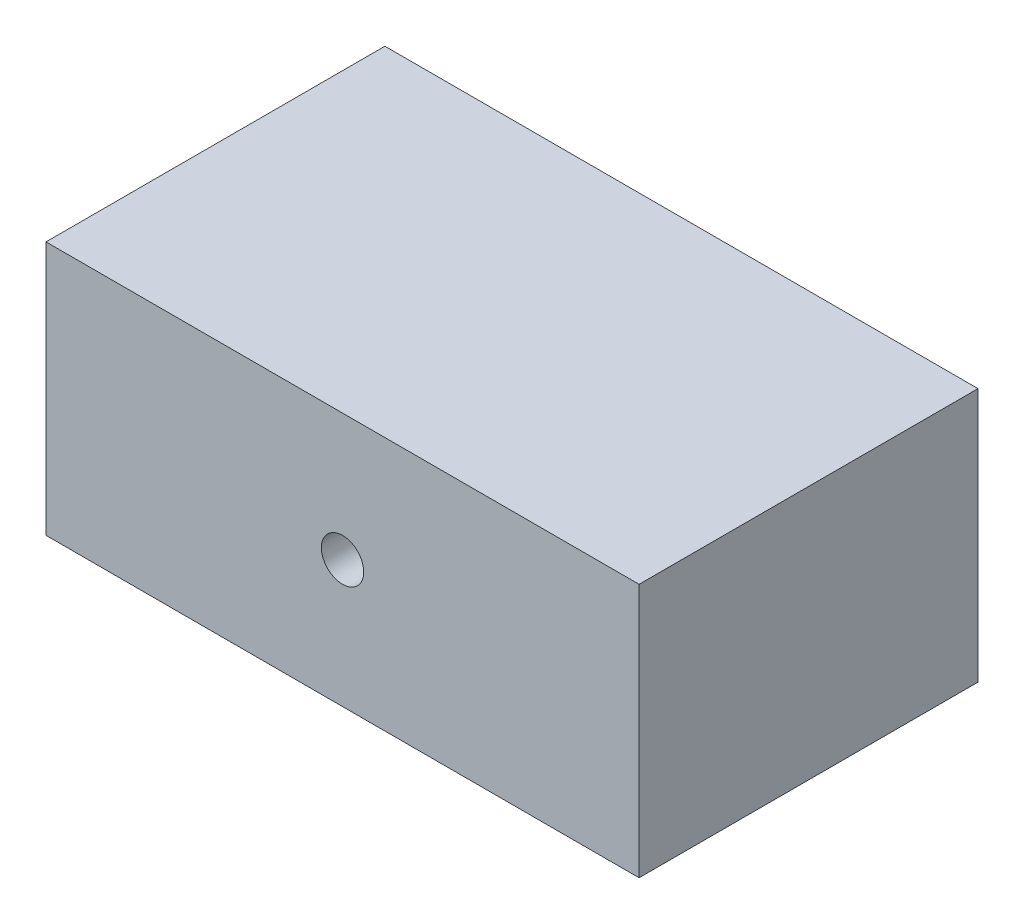
ISO-10303-21;
HEADER;
FILE_DESCRIPTION(('STEP AP214'),'2;1');
FILE_NAME('part.step','',(''),(''),'','','');
FILE_SCHEMA(('AUTOMOTIVE_DESIGN { 1 0 10303 214 1 1 1 1 }'));
ENDSEC;
DATA;
#1=APPLICATION_CONTEXT('core data for automotive mechanical design processes');
#2=APPLICATION_PROTOCOL_DEFINITION('international standard','automotive_design',2000,#1);
#3=PRODUCT_CONTEXT('',#1,'mechanical');
#4=PRODUCT('Part','Part','',(#3));
#5=PRODUCT_RELATED_PRODUCT_CATEGORY('part','',(#4));
#6=PRODUCT_DEFINITION_FORMATION('','',#4);
#7=PRODUCT_DEFINITION_CONTEXT('part definition',#1,'design');
#8=PRODUCT_DEFINITION('design','',#6,#7);
#9=PRODUCT_DEFINITION_SHAPE('','',#8);
#10=(LENGTH_UNIT() NAMED_UNIT(*) SI_UNIT(.MILLI.,.METRE.));
#11=(NAMED_UNIT(*) PLANE_ANGLE_UNIT() SI_UNIT($,.RADIAN.));
#12=(NAMED_UNIT(*) SI_UNIT($,.STERADIAN.) SOLID_ANGLE_UNIT());
#13=UNCERTAINTY_MEASURE_WITH_UNIT(LENGTH_MEASURE(1.E-05),#10,'distance_accuracy_value','');
#14=(GEOMETRIC_REPRESENTATION_CONTEXT(3) GLOBAL_UNCERTAINTY_ASSIGNED_CONTEXT((#13)) GLOBAL_UNIT_ASSIGNED_CONTEXT((#10,
#11,#12)) REPRESENTATION_CONTEXT('',''));
#15=CARTESIAN_POINT('',(0.,0.,0.));
#16=DIRECTION('',(0.,0.,1.));
#17=DIRECTION('',(1.,0.,0.));
#18=AXIS2_PLACEMENT_3D('',#15,#16,#17);
#19=CARTESIAN_POINT('',(0.,0.,50.8));
#20=DIRECTION('',(0.,0.,-1.));
#21=DIRECTION('',(-1.,0.,0.));
#22=AXIS2_PLACEMENT_3D('',#19,#20,#21);
#23=PLANE('',#22);
#24=DIRECTION('',(0.,-1.,0.));
#25=VECTOR('',#24,1.);
#26=CARTESIAN_POINT('',(0.,0.,50.8));
#27=LINE('',#26,#25);
#28=CARTESIAN_POINT('',(0.,38.1,50.8));
#29=VERTEX_POINT('',#28);
#30=CARTESIAN_POINT('',(0.,0.,50.8));
#31=VERTEX_POINT('',#30);
#32=EDGE_CURVE('E92',#29,#31,#27,.T.);
#33=ORIENTED_EDGE('',*,*,#32,.T.);
#34=DIRECTION('',(1.,0.,0.));
#35=VECTOR('',#34,1.);
#36=CARTESIAN_POINT('',(0.,0.,50.8));
#37=LINE('',#36,#35);
#38=CARTESIAN_POINT('',(88.9,0.,50.8));
#39=VERTEX_POINT('',#38);
#40=EDGE_CURVE('E87',#31,#39,#37,.T.);
#41=ORIENTED_EDGE('',*,*,#40,.T.);
#42=DIRECTION('',(0.,1.,0.));
#43=VECTOR('',#42,1.);
#44=CARTESIAN_POINT('',(88.9,0.,50.8));
#45=LINE('',#44,#43);
#46=CARTESIAN_POINT('',(88.9,38.1,50.8));
#47=VERTEX_POINT('',#46);
#48=EDGE_CURVE('E90',#39,#47,#45,.T.);
#49=ORIENTED_EDGE('',*,*,#48,.T.);
#50=DIRECTION('',(-1.,0.,0.));
#51=VECTOR('',#50,1.);
#52=CARTESIAN_POINT('',(0.,38.1,50.8));
#53=LINE('',#52,#51);
#54=EDGE_CURVE('E57',#47,#29,#53,.T.);
#55=ORIENTED_EDGE('',*,*,#54,.T.);
#56=EDGE_LOOP('',(#33,#41,#49,#55));
#57=FACE_BOUND('',#56,.T.);
#58=CARTESIAN_POINT('',(44.45,19.05,50.8));
#59=DIRECTION('',(0.,0.,1.));
#60=DIRECTION('',(1.,0.,0.));
#61=AXIS2_PLACEMENT_3D('',#58,#59,#60);
#62=CIRCLE('',#61,3.175);
#63=CARTESIAN_POINT('',(47.625,19.05,50.8));
#64=VERTEX_POINT('',#63);
#65=EDGE_CURVE('E112',#64,#64,#62,.T.);
#66=ORIENTED_EDGE('',*,*,#65,.F.);
#67=EDGE_LOOP('',(#66));
#68=FACE_BOUND('',#67,.T.);
#69=ADVANCED_FACE('F39',(#57,#68),#23,.F.);
#70=CARTESIAN_POINT('',(0.,0.,0.));
#71=DIRECTION('',(0.,0.,-1.));
#72=DIRECTION('',(-1.,0.,0.));
#73=AXIS2_PLACEMENT_3D('',#70,#71,#72);
#74=PLANE('',#73);
#75=DIRECTION('',(0.,-1.,0.));
#76=VECTOR('',#75,1.);
#77=CARTESIAN_POINT('',(0.,0.,0.));
#78=LINE('',#77,#76);
#79=CARTESIAN_POINT('',(0.,38.1,0.));
#80=VERTEX_POINT('',#79);
#81=CARTESIAN_POINT('',(0.,0.,0.));
#82=VERTEX_POINT('',#81);
#83=EDGE_CURVE('E108',#80,#82,#78,.T.);
#84=ORIENTED_EDGE('',*,*,#83,.F.);
#85=DIRECTION('',(-1.,0.,0.));
#86=VECTOR('',#85,1.);
#87=CARTESIAN_POINT('',(0.,38.1,0.));
#88=LINE('',#87,#86);
#89=CARTESIAN_POINT('',(88.9,38.1,0.));
#90=VERTEX_POINT('',#89);
#91=EDGE_CURVE('E80',#90,#80,#88,.T.);
#92=ORIENTED_EDGE('',*,*,#91,.F.);
#93=DIRECTION('',(0.,1.,0.));
#94=VECTOR('',#93,1.);
#95=CARTESIAN_POINT('',(88.9,0.,0.));
#96=LINE('',#95,#94);
#97=CARTESIAN_POINT('',(88.9,0.,0.));
#98=VERTEX_POINT('',#97);
#99=EDGE_CURVE('E74',#98,#90,#96,.T.);
#100=ORIENTED_EDGE('',*,*,#99,.F.);
#101=DIRECTION('',(1.,0.,0.));
#102=VECTOR('',#101,1.);
#103=CARTESIAN_POINT('',(0.,0.,0.));
#104=LINE('',#103,#102);
#105=EDGE_CURVE('E97',#82,#98,#104,.T.);
#106=ORIENTED_EDGE('',*,*,#105,.F.);
#107=EDGE_LOOP('',(#84,#92,#100,#106));
#108=FACE_BOUND('',#107,.T.);
#109=CARTESIAN_POINT('',(44.45,19.05,0.));
#110=DIRECTION('',(0.,0.,1.));
#111=DIRECTION('',(1.,0.,0.));
#112=AXIS2_PLACEMENT_3D('',#109,#110,#111);
#113=CIRCLE('',#112,3.175);
#114=CARTESIAN_POINT('',(47.625,19.05,0.));
#115=VERTEX_POINT('',#114);
#116=EDGE_CURVE('E130',#115,#115,#113,.T.);
#117=ORIENTED_EDGE('',*,*,#116,.T.);
#118=EDGE_LOOP('',(#117));
#119=FACE_BOUND('',#118,.T.);
#120=ADVANCED_FACE('F125',(#108,#119),#74,.T.);
#121=CARTESIAN_POINT('',(0.,0.,50.8));
#122=DIRECTION('',(1.,0.,0.));
#123=DIRECTION('',(0.,0.,-1.));
#124=AXIS2_PLACEMENT_3D('',#121,#122,#123);
#125=PLANE('',#124);
#126=ORIENTED_EDGE('',*,*,#83,.T.);
#127=DIRECTION('',(0.,0.,-1.));
#128=VECTOR('',#127,1.);
#129=CARTESIAN_POINT('',(0.,0.,50.8));
#130=LINE('',#129,#128);
#131=EDGE_CURVE('E11',#31,#82,#130,.T.);
#132=ORIENTED_EDGE('',*,*,#131,.F.);
#133=ORIENTED_EDGE('',*,*,#32,.F.);
#134=DIRECTION('',(0.,0.,-1.));
#135=VECTOR('',#134,1.);
#136=CARTESIAN_POINT('',(0.,38.1,50.8));
#137=LINE('',#136,#135);
#138=EDGE_CURVE('E104',#29,#80,#137,.T.);
#139=ORIENTED_EDGE('',*,*,#138,.T.);
#140=EDGE_LOOP('',(#126,#132,#133,#139));
#141=FACE_BOUND('',#140,.T.);
#142=ADVANCED_FACE('F41',(#141),#125,.F.);
#143=CARTESIAN_POINT('',(0.,0.,50.8));
#144=DIRECTION('',(0.,1.,0.));
#145=DIRECTION('',(0.,0.,1.));
#146=AXIS2_PLACEMENT_3D('',#143,#144,#145);
#147=PLANE('',#146);
#148=ORIENTED_EDGE('',*,*,#105,.T.);
#149=DIRECTION('',(0.,0.,-1.));
#150=VECTOR('',#149,1.);
#151=CARTESIAN_POINT('',(88.9,0.,50.8));
#152=LINE('',#151,#150);
#153=EDGE_CURVE('E49',#39,#98,#152,.T.);
#154=ORIENTED_EDGE('',*,*,#153,.F.);
#155=ORIENTED_EDGE('',*,*,#40,.F.);
#156=ORIENTED_EDGE('',*,*,#131,.T.);
#157=EDGE_LOOP('',(#148,#154,#155,#156));
#158=FACE_BOUND('',#157,.T.);
#159=ADVANCED_FACE('F96',(#158),#147,.F.);
#160=CARTESIAN_POINT('',(88.9,0.,50.8));
#161=DIRECTION('',(-1.,0.,0.));
#162=DIRECTION('',(0.,0.,1.));
#163=AXIS2_PLACEMENT_3D('',#160,#161,#162);
#164=PLANE('',#163);
#165=ORIENTED_EDGE('',*,*,#99,.T.);
#166=DIRECTION('',(0.,0.,-1.));
#167=VECTOR('',#166,1.);
#168=CARTESIAN_POINT('',(88.9,38.1,50.8));
#169=LINE('',#168,#167);
#170=EDGE_CURVE('E99',#47,#90,#169,.T.);
#171=ORIENTED_EDGE('',*,*,#170,.F.);
#172=ORIENTED_EDGE('',*,*,#48,.F.);
#173=ORIENTED_EDGE('',*,*,#153,.T.);
#174=EDGE_LOOP('',(#165,#171,#172,#173));
#175=FACE_BOUND('',#174,.T.);
#176=ADVANCED_FACE('F100',(#175),#164,.F.);
#177=CARTESIAN_POINT('',(0.,38.1,50.8));
#178=DIRECTION('',(0.,-1.,0.));
#179=DIRECTION('',(0.,0.,-1.));
#180=AXIS2_PLACEMENT_3D('',#177,#178,#179);
#181=PLANE('',#180);
#182=ORIENTED_EDGE('',*,*,#91,.T.);
#183=ORIENTED_EDGE('',*,*,#138,.F.);
#184=ORIENTED_EDGE('',*,*,#54,.F.);
#185=ORIENTED_EDGE('',*,*,#170,.T.);
#186=EDGE_LOOP('',(#182,#183,#184,#185));
#187=FACE_BOUND('',#186,.T.);
#188=ADVANCED_FACE('F122',(#187),#181,.F.);
#189=CARTESIAN_POINT('',(44.45,19.05,50.8));
#190=DIRECTION('',(0.,0.,-1.));
#191=DIRECTION('',(-1.,0.,0.));
#192=AXIS2_PLACEMENT_3D('',#189,#190,#191);
#193=CYLINDRICAL_SURFACE('',#192,3.175);
#194=ORIENTED_EDGE('',*,*,#65,.T.);
#195=EDGE_LOOP('',(#194));
#196=FACE_BOUND('',#195,.T.);
#197=ORIENTED_EDGE('',*,*,#116,.F.);
#198=EDGE_LOOP('',(#197));
#199=FACE_BOUND('',#198,.T.);
#200=ADVANCED_FACE('F138',(#196,#199),#193,.F.);
#201=CLOSED_SHELL('',(#69,#120,#142,#159,#176,#188,#200));
#202=MANIFOLD_SOLID_BREP('B2',#201);
#203=ADVANCED_BREP_SHAPE_REPRESENTATION('',(#18,#202),#14);
#204=SHAPE_DEFINITION_REPRESENTATION(#9,#203);
ENDSEC;
END-ISO-10303-21;
